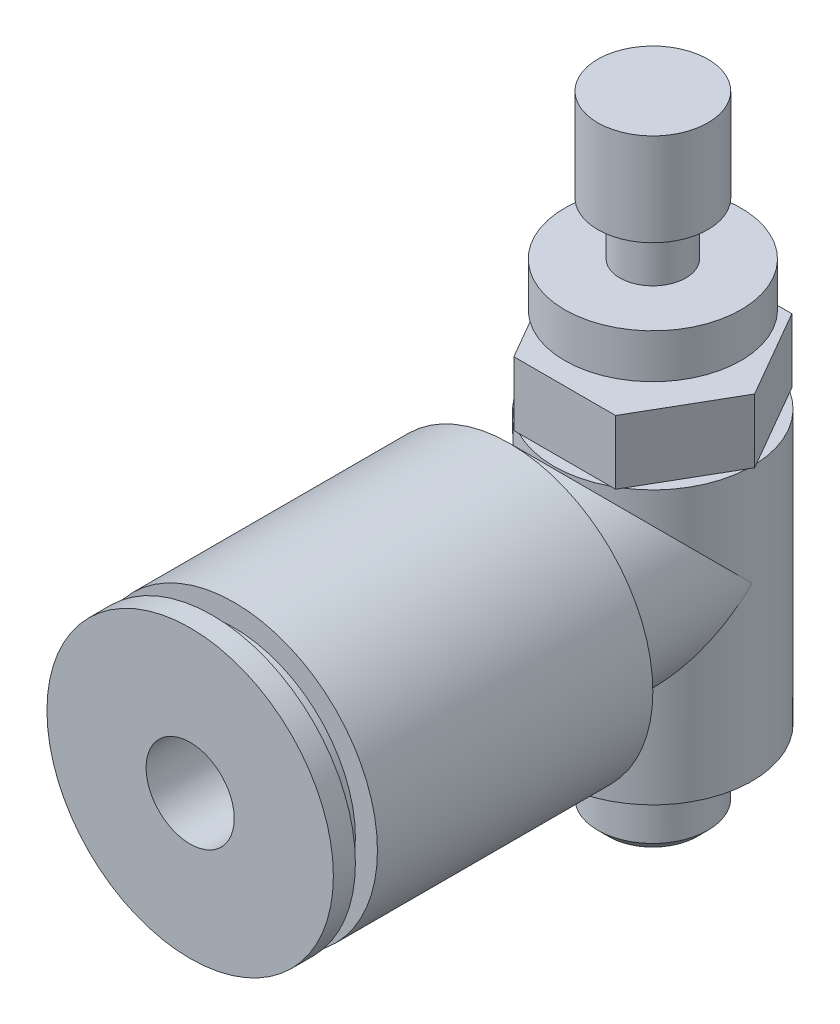
ISO-10303-21;
HEADER;
FILE_DESCRIPTION(('STEP AP214'),'2;1');
FILE_NAME('part.step','',(''),(''),'','','');
FILE_SCHEMA(('AUTOMOTIVE_DESIGN { 1 0 10303 214 1 1 1 1 }'));
ENDSEC;
DATA;
#1=APPLICATION_CONTEXT('core data for automotive mechanical design processes');
#2=APPLICATION_PROTOCOL_DEFINITION('international standard','automotive_design',2000,#1);
#3=PRODUCT_CONTEXT('',#1,'mechanical');
#4=PRODUCT('Part','Part','',(#3));
#5=PRODUCT_RELATED_PRODUCT_CATEGORY('part','',(#4));
#6=PRODUCT_DEFINITION_FORMATION('','',#4);
#7=PRODUCT_DEFINITION_CONTEXT('part definition',#1,'design');
#8=PRODUCT_DEFINITION('design','',#6,#7);
#9=PRODUCT_DEFINITION_SHAPE('','',#8);
#10=(LENGTH_UNIT() NAMED_UNIT(*) SI_UNIT(.MILLI.,.METRE.));
#11=(NAMED_UNIT(*) PLANE_ANGLE_UNIT() SI_UNIT($,.RADIAN.));
#12=(NAMED_UNIT(*) SI_UNIT($,.STERADIAN.) SOLID_ANGLE_UNIT());
#13=UNCERTAINTY_MEASURE_WITH_UNIT(LENGTH_MEASURE(1.E-05),#10,'distance_accuracy_value','');
#14=(GEOMETRIC_REPRESENTATION_CONTEXT(3) GLOBAL_UNCERTAINTY_ASSIGNED_CONTEXT((#13)) GLOBAL_UNIT_ASSIGNED_CONTEXT((#10,
#11,#12)) REPRESENTATION_CONTEXT('',''));
#15=CARTESIAN_POINT('',(0.,0.,0.));
#16=DIRECTION('',(0.,0.,1.));
#17=DIRECTION('',(1.,0.,0.));
#18=AXIS2_PLACEMENT_3D('',#15,#16,#17);
#19=CARTESIAN_POINT('',(-2.3094010767585,4.6,4.));
#20=DIRECTION('',(0.,1.,0.));
#21=DIRECTION('',(0.,0.,1.));
#22=AXIS2_PLACEMENT_3D('',#19,#20,#21);
#23=PLANE('',#22);
#24=DIRECTION('',(1.,0.,0.));
#25=VECTOR('',#24,1.);
#26=CARTESIAN_POINT('',(-2.3094010767585,4.6,4.));
#27=LINE('',#26,#25);
#28=CARTESIAN_POINT('',(2.06155281280883,4.6,4.));
#29=VERTEX_POINT('',#28);
#30=CARTESIAN_POINT('',(2.3094010767585,4.6,4.));
#31=VERTEX_POINT('',#30);
#32=EDGE_CURVE('E262',#29,#31,#27,.T.);
#33=ORIENTED_EDGE('',*,*,#32,.F.);
#34=CARTESIAN_POINT('',(0.,4.6,0.));
#35=DIRECTION('',(0.,1.,0.));
#36=DIRECTION('',(0.,0.,1.));
#37=AXIS2_PLACEMENT_3D('',#34,#35,#36);
#38=CIRCLE('',#37,4.5);
#39=CARTESIAN_POINT('',(2.43332520873333,4.6,3.78535710713572));
#40=VERTEX_POINT('',#39);
#41=EDGE_CURVE('E226',#29,#40,#38,.T.);
#42=ORIENTED_EDGE('',*,*,#41,.T.);
#43=DIRECTION('',(0.500000000000001,0.,-0.866025403784438));
#44=VECTOR('',#43,1.);
#45=CARTESIAN_POINT('',(2.3094010767585,4.6,4.));
#46=LINE('',#45,#44);
#47=EDGE_CURVE('E270',#31,#40,#46,.T.);
#48=ORIENTED_EDGE('',*,*,#47,.F.);
#49=EDGE_LOOP('',(#33,#42,#48));
#50=FACE_BOUND('',#49,.T.);
#51=ADVANCED_FACE('F32',(#50),#23,.F.);
#52=CARTESIAN_POINT('',(4.49487802154217,4.6,0.214642892864293));
#53=VERTEX_POINT('',#52);
#54=CARTESIAN_POINT('',(4.61880215351701,4.6,0.));
#55=VERTEX_POINT('',#54);
#56=EDGE_CURVE('E269',#53,#55,#46,.T.);
#57=ORIENTED_EDGE('',*,*,#56,.F.);
#58=CARTESIAN_POINT('',(4.49487802154217,4.6,-0.214642892864295));
#59=VERTEX_POINT('',#58);
#60=EDGE_CURVE('E132',#53,#59,#38,.T.);
#61=ORIENTED_EDGE('',*,*,#60,.T.);
#62=DIRECTION('',(-0.500000000000001,0.,-0.866025403784438));
#63=VECTOR('',#62,1.);
#64=CARTESIAN_POINT('',(4.61880215351701,4.6,0.));
#65=LINE('',#64,#63);
#66=EDGE_CURVE('E274',#55,#59,#65,.T.);
#67=ORIENTED_EDGE('',*,*,#66,.F.);
#68=EDGE_LOOP('',(#57,#61,#67));
#69=FACE_BOUND('',#68,.T.);
#70=ADVANCED_FACE('F160',(#69),#23,.F.);
#71=CARTESIAN_POINT('',(2.43332520873334,4.6,-3.78535710713572));
#72=VERTEX_POINT('',#71);
#73=CARTESIAN_POINT('',(2.3094010767585,4.6,-4.));
#74=VERTEX_POINT('',#73);
#75=EDGE_CURVE('E272',#72,#74,#65,.T.);
#76=ORIENTED_EDGE('',*,*,#75,.F.);
#77=CARTESIAN_POINT('',(2.06155281280883,4.6,-4.));
#78=VERTEX_POINT('',#77);
#79=EDGE_CURVE('E135',#72,#78,#38,.T.);
#80=ORIENTED_EDGE('',*,*,#79,.T.);
#81=DIRECTION('',(-1.,0.,0.));
#82=VECTOR('',#81,1.);
#83=CARTESIAN_POINT('',(2.3094010767585,4.6,-4.));
#84=LINE('',#83,#82);
#85=EDGE_CURVE('E209',#74,#78,#84,.T.);
#86=ORIENTED_EDGE('',*,*,#85,.F.);
#87=EDGE_LOOP('',(#76,#80,#86));
#88=FACE_BOUND('',#87,.T.);
#89=ADVANCED_FACE('F167',(#88),#23,.F.);
#90=CARTESIAN_POINT('',(-2.06155281280883,4.6,-4.));
#91=VERTEX_POINT('',#90);
#92=CARTESIAN_POINT('',(-2.3094010767585,4.6,-4.));
#93=VERTEX_POINT('',#92);
#94=EDGE_CURVE('E276',#91,#93,#84,.T.);
#95=ORIENTED_EDGE('',*,*,#94,.F.);
#96=CARTESIAN_POINT('',(-2.43332520873333,4.6,-3.78535710713572));
#97=VERTEX_POINT('',#96);
#98=EDGE_CURVE('E303',#91,#97,#38,.T.);
#99=ORIENTED_EDGE('',*,*,#98,.T.);
#100=DIRECTION('',(-0.500000000000001,0.,0.866025403784438));
#101=VECTOR('',#100,1.);
#102=CARTESIAN_POINT('',(-2.3094010767585,4.6,-4.));
#103=LINE('',#102,#101);
#104=EDGE_CURVE('E211',#93,#97,#103,.T.);
#105=ORIENTED_EDGE('',*,*,#104,.F.);
#106=EDGE_LOOP('',(#95,#99,#105));
#107=FACE_BOUND('',#106,.T.);
#108=ADVANCED_FACE('F189',(#107),#23,.F.);
#109=CARTESIAN_POINT('',(-4.49487802154217,4.6,-0.214642892864293));
#110=VERTEX_POINT('',#109);
#111=CARTESIAN_POINT('',(-4.61880215351701,4.6,0.));
#112=VERTEX_POINT('',#111);
#113=EDGE_CURVE('E201',#110,#112,#103,.T.);
#114=ORIENTED_EDGE('',*,*,#113,.F.);
#115=CARTESIAN_POINT('',(-4.49487802154217,4.6,0.214642892864295));
#116=VERTEX_POINT('',#115);
#117=EDGE_CURVE('E203',#110,#116,#38,.T.);
#118=ORIENTED_EDGE('',*,*,#117,.T.);
#119=DIRECTION('',(0.500000000000001,0.,0.866025403784438));
#120=VECTOR('',#119,1.);
#121=CARTESIAN_POINT('',(-4.61880215351701,4.6,0.));
#122=LINE('',#121,#120);
#123=EDGE_CURVE('E205',#112,#116,#122,.T.);
#124=ORIENTED_EDGE('',*,*,#123,.F.);
#125=EDGE_LOOP('',(#114,#118,#124));
#126=FACE_BOUND('',#125,.T.);
#127=ADVANCED_FACE('F176',(#126),#23,.F.);
#128=CARTESIAN_POINT('',(-4.61880215351701,4.6,0.));
#129=DIRECTION('',(-0.866025403784438,0.,0.500000000000001));
#130=DIRECTION('',(0.500000000000001,0.,0.866025403784438));
#131=AXIS2_PLACEMENT_3D('',#128,#129,#130);
#132=PLANE('',#131);
#133=DIRECTION('',(0.500000000000001,0.,0.866025403784438));
#134=VECTOR('',#133,1.);
#135=CARTESIAN_POINT('',(-4.61880215351701,7.5,0.));
#136=LINE('',#135,#134);
#137=CARTESIAN_POINT('',(-4.61880215351701,7.5,0.));
#138=VERTEX_POINT('',#137);
#139=CARTESIAN_POINT('',(-2.3094010767585,7.5,4.));
#140=VERTEX_POINT('',#139);
#141=EDGE_CURVE('E222',#138,#140,#136,.T.);
#142=ORIENTED_EDGE('',*,*,#141,.F.);
#143=DIRECTION('',(0.,1.,0.));
#144=VECTOR('',#143,1.);
#145=CARTESIAN_POINT('',(-4.61880215351701,4.6,0.));
#146=LINE('',#145,#144);
#147=EDGE_CURVE('E242',#112,#138,#146,.T.);
#148=ORIENTED_EDGE('',*,*,#147,.F.);
#149=ORIENTED_EDGE('',*,*,#123,.T.);
#150=CARTESIAN_POINT('',(-2.43332520873334,4.6,3.78535710713572));
#151=VERTEX_POINT('',#150);
#152=EDGE_CURVE('E261',#116,#151,#122,.T.);
#153=ORIENTED_EDGE('',*,*,#152,.T.);
#154=CARTESIAN_POINT('',(-2.3094010767585,4.6,4.));
#155=VERTEX_POINT('',#154);
#156=EDGE_CURVE('E241',#151,#155,#122,.T.);
#157=ORIENTED_EDGE('',*,*,#156,.T.);
#158=DIRECTION('',(0.,1.,0.));
#159=VECTOR('',#158,1.);
#160=CARTESIAN_POINT('',(-2.3094010767585,4.6,4.));
#161=LINE('',#160,#159);
#162=EDGE_CURVE('E139',#155,#140,#161,.T.);
#163=ORIENTED_EDGE('',*,*,#162,.T.);
#164=EDGE_LOOP('',(#142,#148,#149,#153,#157,#163));
#165=FACE_BOUND('',#164,.T.);
#166=ADVANCED_FACE('F188',(#165),#132,.T.);
#167=CARTESIAN_POINT('',(-2.3094010767585,4.6,-4.));
#168=DIRECTION('',(-0.866025403784438,0.,-0.500000000000001));
#169=DIRECTION('',(-0.500000000000001,0.,0.866025403784438));
#170=AXIS2_PLACEMENT_3D('',#167,#168,#169);
#171=PLANE('',#170);
#172=DIRECTION('',(-0.500000000000001,0.,0.866025403784438));
#173=VECTOR('',#172,1.);
#174=CARTESIAN_POINT('',(-2.3094010767585,7.5,-4.));
#175=LINE('',#174,#173);
#176=CARTESIAN_POINT('',(-2.3094010767585,7.5,-4.));
#177=VERTEX_POINT('',#176);
#178=EDGE_CURVE('E238',#177,#138,#175,.T.);
#179=ORIENTED_EDGE('',*,*,#178,.F.);
#180=DIRECTION('',(0.,1.,0.));
#181=VECTOR('',#180,1.);
#182=CARTESIAN_POINT('',(-2.3094010767585,4.6,-4.));
#183=LINE('',#182,#181);
#184=EDGE_CURVE('E245',#93,#177,#183,.T.);
#185=ORIENTED_EDGE('',*,*,#184,.F.);
#186=ORIENTED_EDGE('',*,*,#104,.T.);
#187=EDGE_CURVE('E208',#97,#110,#103,.T.);
#188=ORIENTED_EDGE('',*,*,#187,.T.);
#189=ORIENTED_EDGE('',*,*,#113,.T.);
#190=ORIENTED_EDGE('',*,*,#147,.T.);
#191=EDGE_LOOP('',(#179,#185,#186,#188,#189,#190));
#192=FACE_BOUND('',#191,.T.);
#193=ADVANCED_FACE('F195',(#192),#171,.T.);
#194=CARTESIAN_POINT('',(2.3094010767585,4.6,-4.));
#195=DIRECTION('',(0.,0.,-1.));
#196=DIRECTION('',(-1.,0.,0.));
#197=AXIS2_PLACEMENT_3D('',#194,#195,#196);
#198=PLANE('',#197);
#199=DIRECTION('',(-1.,0.,0.));
#200=VECTOR('',#199,1.);
#201=CARTESIAN_POINT('',(2.3094010767585,7.5,-4.));
#202=LINE('',#201,#200);
#203=CARTESIAN_POINT('',(2.3094010767585,7.5,-4.));
#204=VERTEX_POINT('',#203);
#205=EDGE_CURVE('E235',#204,#177,#202,.T.);
#206=ORIENTED_EDGE('',*,*,#205,.F.);
#207=DIRECTION('',(0.,1.,0.));
#208=VECTOR('',#207,1.);
#209=CARTESIAN_POINT('',(2.3094010767585,4.6,-4.));
#210=LINE('',#209,#208);
#211=EDGE_CURVE('E247',#74,#204,#210,.T.);
#212=ORIENTED_EDGE('',*,*,#211,.F.);
#213=ORIENTED_EDGE('',*,*,#85,.T.);
#214=EDGE_CURVE('E282',#78,#91,#84,.T.);
#215=ORIENTED_EDGE('',*,*,#214,.T.);
#216=ORIENTED_EDGE('',*,*,#94,.T.);
#217=ORIENTED_EDGE('',*,*,#184,.T.);
#218=EDGE_LOOP('',(#206,#212,#213,#215,#216,#217));
#219=FACE_BOUND('',#218,.T.);
#220=ADVANCED_FACE('F292',(#219),#198,.T.);
#221=CARTESIAN_POINT('',(4.61880215351701,4.6,0.));
#222=DIRECTION('',(0.866025403784438,0.,-0.500000000000001));
#223=DIRECTION('',(-0.500000000000001,0.,-0.866025403784438));
#224=AXIS2_PLACEMENT_3D('',#221,#222,#223);
#225=PLANE('',#224);
#226=DIRECTION('',(-0.500000000000001,0.,-0.866025403784438));
#227=VECTOR('',#226,1.);
#228=CARTESIAN_POINT('',(4.61880215351701,7.5,0.));
#229=LINE('',#228,#227);
#230=CARTESIAN_POINT('',(4.61880215351701,7.5,0.));
#231=VERTEX_POINT('',#230);
#232=EDGE_CURVE('E232',#231,#204,#229,.T.);
#233=ORIENTED_EDGE('',*,*,#232,.F.);
#234=DIRECTION('',(0.,1.,0.));
#235=VECTOR('',#234,1.);
#236=CARTESIAN_POINT('',(4.61880215351701,4.6,0.));
#237=LINE('',#236,#235);
#238=EDGE_CURVE('E249',#55,#231,#237,.T.);
#239=ORIENTED_EDGE('',*,*,#238,.F.);
#240=ORIENTED_EDGE('',*,*,#66,.T.);
#241=EDGE_CURVE('E277',#59,#72,#65,.T.);
#242=ORIENTED_EDGE('',*,*,#241,.T.);
#243=ORIENTED_EDGE('',*,*,#75,.T.);
#244=ORIENTED_EDGE('',*,*,#211,.T.);
#245=EDGE_LOOP('',(#233,#239,#240,#242,#243,#244));
#246=FACE_BOUND('',#245,.T.);
#247=ADVANCED_FACE('F286',(#246),#225,.T.);
#248=CARTESIAN_POINT('',(2.3094010767585,4.6,4.));
#249=DIRECTION('',(0.866025403784438,0.,0.500000000000001));
#250=DIRECTION('',(0.500000000000001,0.,-0.866025403784438));
#251=AXIS2_PLACEMENT_3D('',#248,#249,#250);
#252=PLANE('',#251);
#253=DIRECTION('',(0.500000000000001,0.,-0.866025403784438));
#254=VECTOR('',#253,1.);
#255=CARTESIAN_POINT('',(2.3094010767585,7.5,4.));
#256=LINE('',#255,#254);
#257=CARTESIAN_POINT('',(2.3094010767585,7.5,4.));
#258=VERTEX_POINT('',#257);
#259=EDGE_CURVE('E229',#258,#231,#256,.T.);
#260=ORIENTED_EDGE('',*,*,#259,.F.);
#261=DIRECTION('',(0.,1.,0.));
#262=VECTOR('',#261,1.);
#263=CARTESIAN_POINT('',(2.3094010767585,4.6,4.));
#264=LINE('',#263,#262);
#265=EDGE_CURVE('E250',#31,#258,#264,.T.);
#266=ORIENTED_EDGE('',*,*,#265,.F.);
#267=ORIENTED_EDGE('',*,*,#47,.T.);
#268=EDGE_CURVE('E273',#40,#53,#46,.T.);
#269=ORIENTED_EDGE('',*,*,#268,.T.);
#270=ORIENTED_EDGE('',*,*,#56,.T.);
#271=ORIENTED_EDGE('',*,*,#238,.T.);
#272=EDGE_LOOP('',(#260,#266,#267,#269,#270,#271));
#273=FACE_BOUND('',#272,.T.);
#274=ADVANCED_FACE('F183',(#273),#252,.T.);
#275=CARTESIAN_POINT('',(-2.3094010767585,4.6,4.));
#276=DIRECTION('',(0.,0.,1.));
#277=DIRECTION('',(1.,0.,0.));
#278=AXIS2_PLACEMENT_3D('',#275,#276,#277);
#279=PLANE('',#278);
#280=DIRECTION('',(1.,0.,0.));
#281=VECTOR('',#280,1.);
#282=CARTESIAN_POINT('',(-2.3094010767585,7.5,4.));
#283=LINE('',#282,#281);
#284=EDGE_CURVE('E225',#140,#258,#283,.T.);
#285=ORIENTED_EDGE('',*,*,#284,.F.);
#286=ORIENTED_EDGE('',*,*,#162,.F.);
#287=CARTESIAN_POINT('',(-2.06155281280883,4.6,4.));
#288=VERTEX_POINT('',#287);
#289=EDGE_CURVE('E266',#155,#288,#27,.T.);
#290=ORIENTED_EDGE('',*,*,#289,.T.);
#291=EDGE_CURVE('E264',#288,#29,#27,.T.);
#292=ORIENTED_EDGE('',*,*,#291,.T.);
#293=ORIENTED_EDGE('',*,*,#32,.T.);
#294=ORIENTED_EDGE('',*,*,#265,.T.);
#295=EDGE_LOOP('',(#285,#286,#290,#292,#293,#294));
#296=FACE_BOUND('',#295,.T.);
#297=ADVANCED_FACE('F174',(#296),#279,.T.);
#298=ORIENTED_EDGE('',*,*,#156,.F.);
#299=EDGE_CURVE('E244',#151,#288,#38,.T.);
#300=ORIENTED_EDGE('',*,*,#299,.T.);
#301=ORIENTED_EDGE('',*,*,#289,.F.);
#302=EDGE_LOOP('',(#298,#300,#301));
#303=FACE_BOUND('',#302,.T.);
#304=ADVANCED_FACE('F163',(#303),#23,.F.);
#305=CARTESIAN_POINT('',(-2.3094010767585,7.5,4.));
#306=DIRECTION('',(0.,1.,0.));
#307=DIRECTION('',(0.,0.,1.));
#308=AXIS2_PLACEMENT_3D('',#305,#306,#307);
#309=PLANE('',#308);
#310=CARTESIAN_POINT('',(0.,7.5,0.));
#311=DIRECTION('',(0.,1.,0.));
#312=DIRECTION('',(0.,0.,1.));
#313=AXIS2_PLACEMENT_3D('',#310,#311,#312);
#314=CIRCLE('',#313,2.5);
#315=CARTESIAN_POINT('',(0.,7.5,2.5));
#316=VERTEX_POINT('',#315);
#317=EDGE_CURVE('E128',#316,#316,#314,.T.);
#318=ORIENTED_EDGE('',*,*,#317,.F.);
#319=EDGE_LOOP('',(#318));
#320=FACE_BOUND('',#319,.T.);
#321=ORIENTED_EDGE('',*,*,#141,.T.);
#322=ORIENTED_EDGE('',*,*,#284,.T.);
#323=ORIENTED_EDGE('',*,*,#259,.T.);
#324=ORIENTED_EDGE('',*,*,#232,.T.);
#325=ORIENTED_EDGE('',*,*,#205,.T.);
#326=ORIENTED_EDGE('',*,*,#178,.T.);
#327=EDGE_LOOP('',(#321,#322,#323,#324,#325,#326));
#328=FACE_BOUND('',#327,.T.);
#329=ADVANCED_FACE('F173',(#320,#328),#309,.T.);
#330=CARTESIAN_POINT('',(0.,4.6,0.));
#331=DIRECTION('',(0.,1.,0.));
#332=DIRECTION('',(0.,0.,1.));
#333=AXIS2_PLACEMENT_3D('',#330,#331,#332);
#334=PLANE('',#333);
#335=ORIENTED_EDGE('',*,*,#152,.F.);
#336=EDGE_CURVE('E306',#116,#151,#38,.T.);
#337=ORIENTED_EDGE('',*,*,#336,.T.);
#338=EDGE_LOOP('',(#335,#337));
#339=FACE_BOUND('',#338,.T.);
#340=ADVANCED_FACE('F181',(#339),#334,.T.);
#341=ORIENTED_EDGE('',*,*,#187,.F.);
#342=EDGE_CURVE('E305',#97,#110,#38,.T.);
#343=ORIENTED_EDGE('',*,*,#342,.T.);
#344=EDGE_LOOP('',(#341,#343));
#345=FACE_BOUND('',#344,.T.);
#346=ADVANCED_FACE('F333',(#345),#334,.T.);
#347=ORIENTED_EDGE('',*,*,#214,.F.);
#348=EDGE_CURVE('E299',#78,#91,#38,.T.);
#349=ORIENTED_EDGE('',*,*,#348,.T.);
#350=EDGE_LOOP('',(#347,#349));
#351=FACE_BOUND('',#350,.T.);
#352=ADVANCED_FACE('F298',(#351),#334,.T.);
#353=ORIENTED_EDGE('',*,*,#241,.F.);
#354=EDGE_CURVE('E304',#59,#72,#38,.T.);
#355=ORIENTED_EDGE('',*,*,#354,.T.);
#356=EDGE_LOOP('',(#353,#355));
#357=FACE_BOUND('',#356,.T.);
#358=ADVANCED_FACE('F328',(#357),#334,.T.);
#359=ORIENTED_EDGE('',*,*,#268,.F.);
#360=EDGE_CURVE('E137',#40,#53,#38,.T.);
#361=ORIENTED_EDGE('',*,*,#360,.T.);
#362=EDGE_LOOP('',(#359,#361));
#363=FACE_BOUND('',#362,.T.);
#364=ADVANCED_FACE('F321',(#363),#334,.T.);
#365=ORIENTED_EDGE('',*,*,#291,.F.);
#366=EDGE_CURVE('E54',#288,#29,#38,.T.);
#367=ORIENTED_EDGE('',*,*,#366,.T.);
#368=EDGE_LOOP('',(#365,#367));
#369=FACE_BOUND('',#368,.T.);
#370=ADVANCED_FACE('F319',(#369),#334,.T.);
#371=CARTESIAN_POINT('',(0.,-11.2,0.));
#372=DIRECTION('',(0.,1.,0.));
#373=DIRECTION('',(0.,0.,1.));
#374=AXIS2_PLACEMENT_3D('',#371,#372,#373);
#375=CYLINDRICAL_SURFACE('',#374,2.5);
#376=CARTESIAN_POINT('',(0.,-10.7099999999768,0.));
#377=DIRECTION('',(0.,-1.,0.));
#378=DIRECTION('',(0.,0.,-1.));
#379=AXIS2_PLACEMENT_3D('',#376,#377,#378);
#380=CIRCLE('',#379,2.5);
#381=CARTESIAN_POINT('',(0.,-10.7099999999768,-2.5));
#382=VERTEX_POINT('',#381);
#383=EDGE_CURVE('E40',#382,#382,#380,.F.);
#384=ORIENTED_EDGE('',*,*,#383,.T.);
#385=EDGE_LOOP('',(#384));
#386=FACE_BOUND('',#385,.T.);
#387=CARTESIAN_POINT('',(0.,-7.78,0.));
#388=DIRECTION('',(0.,1.,0.));
#389=DIRECTION('',(0.,0.,1.));
#390=AXIS2_PLACEMENT_3D('',#387,#388,#389);
#391=CIRCLE('',#390,2.5);
#392=CARTESIAN_POINT('',(0.,-7.78,2.5));
#393=VERTEX_POINT('',#392);
#394=EDGE_CURVE('E313',#393,#393,#391,.T.);
#395=ORIENTED_EDGE('',*,*,#394,.F.);
#396=EDGE_LOOP('',(#395));
#397=FACE_BOUND('',#396,.T.);
#398=ADVANCED_FACE('F146',(#386,#397),#375,.T.);
#399=CARTESIAN_POINT('',(2.5,-11.2,0.));
#400=DIRECTION('',(0.,-1.,0.));
#401=DIRECTION('',(0.,0.,-1.));
#402=AXIS2_PLACEMENT_3D('',#399,#400,#401);
#403=PLANE('',#402);
#404=CARTESIAN_POINT('',(0.,-11.2,0.));
#405=DIRECTION('',(0.,-1.,0.));
#406=DIRECTION('',(0.,0.,-1.));
#407=AXIS2_PLACEMENT_3D('',#404,#405,#406);
#408=CIRCLE('',#407,2.00999999997678);
#409=CARTESIAN_POINT('',(0.,-11.2,-2.00999999997678));
#410=VERTEX_POINT('',#409);
#411=EDGE_CURVE('E11',#410,#410,#408,.T.);
#412=ORIENTED_EDGE('',*,*,#411,.T.);
#413=EDGE_LOOP('',(#412));
#414=FACE_BOUND('',#413,.T.);
#415=ADVANCED_FACE('F327',(#414),#403,.T.);
#416=CARTESIAN_POINT('',(0.,-11.2,0.));
#417=DIRECTION('',(0.,1.,0.));
#418=DIRECTION('',(0.,0.,1.));
#419=AXIS2_PLACEMENT_3D('',#416,#417,#418);
#420=CYLINDRICAL_SURFACE('',#419,4.5);
#421=CARTESIAN_POINT('',(0.,0.,0.));
#422=DIRECTION('',(0.,0.707106781186547,0.707106781186547));
#423=DIRECTION('',(0.,0.707106781186547,-0.707106781186547));
#424=AXIS2_PLACEMENT_3D('',#421,#422,#423);
#425=ELLIPSE('',#424,6.36396103067893,4.5);
#426=CARTESIAN_POINT('',(-4.5,0.,0.));
#427=VERTEX_POINT('',#426);
#428=CARTESIAN_POINT('',(4.5,0.,0.));
#429=VERTEX_POINT('',#428);
#430=EDGE_CURVE('E124',#427,#429,#425,.T.);
#431=ORIENTED_EDGE('',*,*,#430,.F.);
#432=CARTESIAN_POINT('',(0.,0.,0.));
#433=DIRECTION('',(0.,0.707106781186547,-0.707106781186547));
#434=DIRECTION('',(0.,0.707106781186547,0.707106781186547));
#435=AXIS2_PLACEMENT_3D('',#432,#433,#434);
#436=ELLIPSE('',#435,6.36396103067893,4.5);
#437=EDGE_CURVE('E46',#429,#427,#436,.F.);
#438=ORIENTED_EDGE('',*,*,#437,.F.);
#439=EDGE_LOOP('',(#431,#438));
#440=FACE_BOUND('',#439,.T.);
#441=CARTESIAN_POINT('',(0.,-7.78,0.));
#442=DIRECTION('',(0.,1.,0.));
#443=DIRECTION('',(0.,0.,1.));
#444=AXIS2_PLACEMENT_3D('',#441,#442,#443);
#445=CIRCLE('',#444,4.5);
#446=CARTESIAN_POINT('',(0.,-7.78,4.5));
#447=VERTEX_POINT('',#446);
#448=EDGE_CURVE('E310',#447,#447,#445,.T.);
#449=ORIENTED_EDGE('',*,*,#448,.T.);
#450=EDGE_LOOP('',(#449));
#451=FACE_BOUND('',#450,.T.);
#452=ORIENTED_EDGE('',*,*,#41,.F.);
#453=ORIENTED_EDGE('',*,*,#366,.F.);
#454=ORIENTED_EDGE('',*,*,#299,.F.);
#455=ORIENTED_EDGE('',*,*,#336,.F.);
#456=ORIENTED_EDGE('',*,*,#117,.F.);
#457=ORIENTED_EDGE('',*,*,#342,.F.);
#458=ORIENTED_EDGE('',*,*,#98,.F.);
#459=ORIENTED_EDGE('',*,*,#348,.F.);
#460=ORIENTED_EDGE('',*,*,#79,.F.);
#461=ORIENTED_EDGE('',*,*,#354,.F.);
#462=ORIENTED_EDGE('',*,*,#60,.F.);
#463=ORIENTED_EDGE('',*,*,#360,.F.);
#464=EDGE_LOOP('',(#452,#453,#454,#455,#456,#457,#458,#459,#460,#461,#462,#463));
#465=FACE_BOUND('',#464,.T.);
#466=ADVANCED_FACE('F125',(#440,#451,#465),#420,.T.);
#467=CARTESIAN_POINT('',(4.5,-7.78,0.));
#468=DIRECTION('',(0.,-1.,0.));
#469=DIRECTION('',(0.,0.,-1.));
#470=AXIS2_PLACEMENT_3D('',#467,#468,#469);
#471=PLANE('',#470);
#472=ORIENTED_EDGE('',*,*,#394,.T.);
#473=EDGE_LOOP('',(#472));
#474=FACE_BOUND('',#473,.T.);
#475=ORIENTED_EDGE('',*,*,#448,.F.);
#476=EDGE_LOOP('',(#475));
#477=FACE_BOUND('',#476,.T.);
#478=ADVANCED_FACE('F420',(#474,#477),#471,.T.);
#479=CARTESIAN_POINT('',(0.,0.,21.));
#480=DIRECTION('',(0.,0.,1.));
#481=DIRECTION('',(1.,0.,0.));
#482=AXIS2_PLACEMENT_3D('',#479,#480,#481);
#483=PLANE('',#482);
#484=CARTESIAN_POINT('',(0.,0.,21.));
#485=DIRECTION('',(0.,0.,1.));
#486=DIRECTION('',(1.,0.,0.));
#487=AXIS2_PLACEMENT_3D('',#484,#485,#486);
#488=CIRCLE('',#487,2.00000000000001);
#489=CARTESIAN_POINT('',(2.00000000000001,0.,21.));
#490=VERTEX_POINT('',#489);
#491=EDGE_CURVE('E636',#490,#490,#488,.T.);
#492=ORIENTED_EDGE('',*,*,#491,.F.);
#493=EDGE_LOOP('',(#492));
#494=FACE_BOUND('',#493,.T.);
#495=CARTESIAN_POINT('',(0.,0.,21.));
#496=DIRECTION('',(0.,0.,1.));
#497=DIRECTION('',(1.,0.,0.));
#498=AXIS2_PLACEMENT_3D('',#495,#496,#497);
#499=CIRCLE('',#498,6.49999999999999);
#500=CARTESIAN_POINT('',(6.49999999999999,0.,21.));
#501=VERTEX_POINT('',#500);
#502=EDGE_CURVE('E679',#501,#501,#499,.T.);
#503=ORIENTED_EDGE('',*,*,#502,.T.);
#504=EDGE_LOOP('',(#503));
#505=FACE_BOUND('',#504,.T.);
#506=ADVANCED_FACE('F425',(#494,#505),#483,.T.);
#507=CARTESIAN_POINT('',(0.,0.,0.));
#508=DIRECTION('',(0.,0.,1.));
#509=DIRECTION('',(1.,0.,0.));
#510=AXIS2_PLACEMENT_3D('',#507,#508,#509);
#511=CYLINDRICAL_SURFACE('',#510,6.49999999999999);
#512=CARTESIAN_POINT('',(0.,0.,20.));
#513=DIRECTION('',(0.,0.,1.));
#514=DIRECTION('',(1.,0.,0.));
#515=AXIS2_PLACEMENT_3D('',#512,#513,#514);
#516=CIRCLE('',#515,6.49999999999999);
#517=CARTESIAN_POINT('',(6.49999999999999,0.,20.));
#518=VERTEX_POINT('',#517);
#519=EDGE_CURVE('E676',#518,#518,#516,.T.);
#520=ORIENTED_EDGE('',*,*,#519,.T.);
#521=EDGE_LOOP('',(#520));
#522=FACE_BOUND('',#521,.T.);
#523=ORIENTED_EDGE('',*,*,#502,.F.);
#524=EDGE_LOOP('',(#523));
#525=FACE_BOUND('',#524,.T.);
#526=ADVANCED_FACE('F442',(#522,#525),#511,.T.);
#527=CARTESIAN_POINT('',(6.49999999999999,0.,20.));
#528=DIRECTION('',(0.,0.,-1.));
#529=DIRECTION('',(-1.,0.,0.));
#530=AXIS2_PLACEMENT_3D('',#527,#528,#529);
#531=PLANE('',#530);
#532=CARTESIAN_POINT('',(0.,0.,20.));
#533=DIRECTION('',(0.,0.,1.));
#534=DIRECTION('',(1.,0.,0.));
#535=AXIS2_PLACEMENT_3D('',#532,#533,#534);
#536=CIRCLE('',#535,5.50000000000001);
#537=CARTESIAN_POINT('',(5.50000000000001,0.,20.));
#538=VERTEX_POINT('',#537);
#539=EDGE_CURVE('E673',#538,#538,#536,.T.);
#540=ORIENTED_EDGE('',*,*,#539,.T.);
#541=EDGE_LOOP('',(#540));
#542=FACE_BOUND('',#541,.T.);
#543=ORIENTED_EDGE('',*,*,#519,.F.);
#544=EDGE_LOOP('',(#543));
#545=FACE_BOUND('',#544,.T.);
#546=ADVANCED_FACE('F447',(#542,#545),#531,.T.);
#547=CARTESIAN_POINT('',(0.,0.,0.));
#548=DIRECTION('',(0.,0.,1.));
#549=DIRECTION('',(1.,0.,0.));
#550=AXIS2_PLACEMENT_3D('',#547,#548,#549);
#551=CYLINDRICAL_SURFACE('',#550,5.50000000000001);
#552=CARTESIAN_POINT('',(0.,0.,19.));
#553=DIRECTION('',(0.,0.,1.));
#554=DIRECTION('',(1.,0.,0.));
#555=AXIS2_PLACEMENT_3D('',#552,#553,#554);
#556=CIRCLE('',#555,5.50000000000001);
#557=CARTESIAN_POINT('',(5.50000000000001,0.,19.));
#558=VERTEX_POINT('',#557);
#559=EDGE_CURVE('E670',#558,#558,#556,.T.);
#560=ORIENTED_EDGE('',*,*,#559,.T.);
#561=EDGE_LOOP('',(#560));
#562=FACE_BOUND('',#561,.T.);
#563=ORIENTED_EDGE('',*,*,#539,.F.);
#564=EDGE_LOOP('',(#563));
#565=FACE_BOUND('',#564,.T.);
#566=ADVANCED_FACE('F457',(#562,#565),#551,.T.);
#567=CARTESIAN_POINT('',(5.50000000000001,0.,19.));
#568=DIRECTION('',(0.,0.,1.));
#569=DIRECTION('',(1.,0.,0.));
#570=AXIS2_PLACEMENT_3D('',#567,#568,#569);
#571=PLANE('',#570);
#572=CARTESIAN_POINT('',(0.,0.,19.));
#573=DIRECTION('',(0.,0.,1.));
#574=DIRECTION('',(1.,0.,0.));
#575=AXIS2_PLACEMENT_3D('',#572,#573,#574);
#576=CIRCLE('',#575,6.49999999999999);
#577=CARTESIAN_POINT('',(6.49999999999999,0.,19.));
#578=VERTEX_POINT('',#577);
#579=EDGE_CURVE('E667',#578,#578,#576,.T.);
#580=ORIENTED_EDGE('',*,*,#579,.T.);
#581=EDGE_LOOP('',(#580));
#582=FACE_BOUND('',#581,.T.);
#583=ORIENTED_EDGE('',*,*,#559,.F.);
#584=EDGE_LOOP('',(#583));
#585=FACE_BOUND('',#584,.T.);
#586=ADVANCED_FACE('F467',(#582,#585),#571,.T.);
#587=CARTESIAN_POINT('',(0.,0.,0.));
#588=DIRECTION('',(0.,0.,1.));
#589=DIRECTION('',(1.,0.,0.));
#590=AXIS2_PLACEMENT_3D('',#587,#588,#589);
#591=CYLINDRICAL_SURFACE('',#590,6.49999999999999);
#592=CARTESIAN_POINT('',(0.,0.,6.5));
#593=DIRECTION('',(0.,0.,1.));
#594=DIRECTION('',(1.,0.,0.));
#595=AXIS2_PLACEMENT_3D('',#592,#593,#594);
#596=CIRCLE('',#595,6.49999999999999);
#597=CARTESIAN_POINT('',(6.49999999999999,0.,6.5));
#598=VERTEX_POINT('',#597);
#599=EDGE_CURVE('E664',#598,#598,#596,.T.);
#600=ORIENTED_EDGE('',*,*,#599,.T.);
#601=EDGE_LOOP('',(#600));
#602=FACE_BOUND('',#601,.T.);
#603=ORIENTED_EDGE('',*,*,#579,.F.);
#604=EDGE_LOOP('',(#603));
#605=FACE_BOUND('',#604,.T.);
#606=ADVANCED_FACE('F477',(#602,#605),#591,.T.);
#607=CARTESIAN_POINT('',(6.49999999999999,0.,6.5));
#608=DIRECTION('',(0.,0.,-1.));
#609=DIRECTION('',(-1.,0.,0.));
#610=AXIS2_PLACEMENT_3D('',#607,#608,#609);
#611=PLANE('',#610);
#612=CARTESIAN_POINT('',(0.,0.,6.5));
#613=DIRECTION('',(0.,0.,1.));
#614=DIRECTION('',(1.,0.,0.));
#615=AXIS2_PLACEMENT_3D('',#612,#613,#614);
#616=CIRCLE('',#615,4.5);
#617=CARTESIAN_POINT('',(4.5,0.,6.5));
#618=VERTEX_POINT('',#617);
#619=EDGE_CURVE('E661',#618,#618,#616,.T.);
#620=ORIENTED_EDGE('',*,*,#619,.T.);
#621=EDGE_LOOP('',(#620));
#622=FACE_BOUND('',#621,.T.);
#623=ORIENTED_EDGE('',*,*,#599,.F.);
#624=EDGE_LOOP('',(#623));
#625=FACE_BOUND('',#624,.T.);
#626=ADVANCED_FACE('F487',(#622,#625),#611,.T.);
#627=CARTESIAN_POINT('',(0.,0.,0.));
#628=DIRECTION('',(0.,0.,1.));
#629=DIRECTION('',(1.,0.,0.));
#630=AXIS2_PLACEMENT_3D('',#627,#628,#629);
#631=CYLINDRICAL_SURFACE('',#630,4.5);
#632=ORIENTED_EDGE('',*,*,#437,.T.);
#633=ORIENTED_EDGE('',*,*,#430,.T.);
#634=EDGE_LOOP('',(#632,#633));
#635=FACE_BOUND('',#634,.T.);
#636=ORIENTED_EDGE('',*,*,#619,.F.);
#637=EDGE_LOOP('',(#636));
#638=FACE_BOUND('',#637,.T.);
#639=ADVANCED_FACE('F130',(#635,#638),#631,.T.);
#640=CARTESIAN_POINT('',(0.,7.5,0.));
#641=DIRECTION('',(0.,1.,0.));
#642=DIRECTION('',(0.,0.,1.));
#643=AXIS2_PLACEMENT_3D('',#640,#641,#642);
#644=CYLINDRICAL_SURFACE('',#643,2.5);
#645=ORIENTED_EDGE('',*,*,#317,.T.);
#646=EDGE_LOOP('',(#645));
#647=FACE_BOUND('',#646,.T.);
#648=CARTESIAN_POINT('',(0.,8.5,0.));
#649=DIRECTION('',(0.,1.,0.));
#650=DIRECTION('',(0.,0.,1.));
#651=AXIS2_PLACEMENT_3D('',#648,#649,#650);
#652=CIRCLE('',#651,2.5);
#653=CARTESIAN_POINT('',(0.,8.5,2.5));
#654=VERTEX_POINT('',#653);
#655=EDGE_CURVE('E635',#654,#654,#652,.T.);
#656=ORIENTED_EDGE('',*,*,#655,.F.);
#657=EDGE_LOOP('',(#656));
#658=FACE_BOUND('',#657,.T.);
#659=ADVANCED_FACE('F506',(#647,#658),#644,.T.);
#660=CARTESIAN_POINT('',(0.,17.1,0.));
#661=DIRECTION('',(0.,1.,0.));
#662=DIRECTION('',(0.,0.,1.));
#663=AXIS2_PLACEMENT_3D('',#660,#661,#662);
#664=PLANE('',#663);
#665=CARTESIAN_POINT('',(0.,17.1,0.));
#666=DIRECTION('',(0.,1.,0.));
#667=DIRECTION('',(0.,0.,1.));
#668=AXIS2_PLACEMENT_3D('',#665,#666,#667);
#669=CIRCLE('',#668,2.5);
#670=CARTESIAN_POINT('',(0.,17.1,2.5));
#671=VERTEX_POINT('',#670);
#672=EDGE_CURVE('E658',#671,#671,#669,.T.);
#673=ORIENTED_EDGE('',*,*,#672,.T.);
#674=EDGE_LOOP('',(#673));
#675=FACE_BOUND('',#674,.T.);
#676=ADVANCED_FACE('F521',(#675),#664,.T.);
#677=CARTESIAN_POINT('',(0.,7.5,0.));
#678=DIRECTION('',(0.,1.,0.));
#679=DIRECTION('',(0.,0.,1.));
#680=AXIS2_PLACEMENT_3D('',#677,#678,#679);
#681=CYLINDRICAL_SURFACE('',#680,2.5);
#682=CARTESIAN_POINT('',(0.,12.9,0.));
#683=DIRECTION('',(0.,1.,0.));
#684=DIRECTION('',(0.,0.,1.));
#685=AXIS2_PLACEMENT_3D('',#682,#683,#684);
#686=CIRCLE('',#685,2.5);
#687=CARTESIAN_POINT('',(0.,12.9,2.5));
#688=VERTEX_POINT('',#687);
#689=EDGE_CURVE('E655',#688,#688,#686,.T.);
#690=ORIENTED_EDGE('',*,*,#689,.T.);
#691=EDGE_LOOP('',(#690));
#692=FACE_BOUND('',#691,.T.);
#693=ORIENTED_EDGE('',*,*,#672,.F.);
#694=EDGE_LOOP('',(#693));
#695=FACE_BOUND('',#694,.T.);
#696=ADVANCED_FACE('F531',(#692,#695),#681,.T.);
#697=CARTESIAN_POINT('',(2.5,12.9,0.));
#698=DIRECTION('',(0.,-1.,0.));
#699=DIRECTION('',(0.,0.,-1.));
#700=AXIS2_PLACEMENT_3D('',#697,#698,#699);
#701=PLANE('',#700);
#702=CARTESIAN_POINT('',(0.,12.9,0.));
#703=DIRECTION('',(0.,1.,0.));
#704=DIRECTION('',(0.,0.,1.));
#705=AXIS2_PLACEMENT_3D('',#702,#703,#704);
#706=CIRCLE('',#705,1.5);
#707=CARTESIAN_POINT('',(0.,12.9,1.5));
#708=VERTEX_POINT('',#707);
#709=EDGE_CURVE('E652',#708,#708,#706,.T.);
#710=ORIENTED_EDGE('',*,*,#709,.T.);
#711=EDGE_LOOP('',(#710));
#712=FACE_BOUND('',#711,.T.);
#713=ORIENTED_EDGE('',*,*,#689,.F.);
#714=EDGE_LOOP('',(#713));
#715=FACE_BOUND('',#714,.T.);
#716=ADVANCED_FACE('F541',(#712,#715),#701,.T.);
#717=CARTESIAN_POINT('',(0.,7.5,0.));
#718=DIRECTION('',(0.,1.,0.));
#719=DIRECTION('',(0.,0.,1.));
#720=AXIS2_PLACEMENT_3D('',#717,#718,#719);
#721=CYLINDRICAL_SURFACE('',#720,1.5);
#722=CARTESIAN_POINT('',(0.,10.5,0.));
#723=DIRECTION('',(0.,1.,0.));
#724=DIRECTION('',(0.,0.,1.));
#725=AXIS2_PLACEMENT_3D('',#722,#723,#724);
#726=CIRCLE('',#725,1.5);
#727=CARTESIAN_POINT('',(0.,10.5,1.5));
#728=VERTEX_POINT('',#727);
#729=EDGE_CURVE('E649',#728,#728,#726,.T.);
#730=ORIENTED_EDGE('',*,*,#729,.T.);
#731=EDGE_LOOP('',(#730));
#732=FACE_BOUND('',#731,.T.);
#733=ORIENTED_EDGE('',*,*,#709,.F.);
#734=EDGE_LOOP('',(#733));
#735=FACE_BOUND('',#734,.T.);
#736=ADVANCED_FACE('F551',(#732,#735),#721,.T.);
#737=CARTESIAN_POINT('',(1.5,10.5,0.));
#738=DIRECTION('',(0.,1.,0.));
#739=DIRECTION('',(0.,0.,1.));
#740=AXIS2_PLACEMENT_3D('',#737,#738,#739);
#741=PLANE('',#740);
#742=CARTESIAN_POINT('',(0.,10.5,0.));
#743=DIRECTION('',(0.,1.,0.));
#744=DIRECTION('',(0.,0.,1.));
#745=AXIS2_PLACEMENT_3D('',#742,#743,#744);
#746=CIRCLE('',#745,4.);
#747=CARTESIAN_POINT('',(0.,10.5,4.));
#748=VERTEX_POINT('',#747);
#749=EDGE_CURVE('E646',#748,#748,#746,.T.);
#750=ORIENTED_EDGE('',*,*,#749,.T.);
#751=EDGE_LOOP('',(#750));
#752=FACE_BOUND('',#751,.T.);
#753=ORIENTED_EDGE('',*,*,#729,.F.);
#754=EDGE_LOOP('',(#753));
#755=FACE_BOUND('',#754,.T.);
#756=ADVANCED_FACE('F561',(#752,#755),#741,.T.);
#757=CARTESIAN_POINT('',(0.,7.5,0.));
#758=DIRECTION('',(0.,1.,0.));
#759=DIRECTION('',(0.,0.,1.));
#760=AXIS2_PLACEMENT_3D('',#757,#758,#759);
#761=CYLINDRICAL_SURFACE('',#760,4.);
#762=CARTESIAN_POINT('',(0.,8.5,0.));
#763=DIRECTION('',(0.,1.,0.));
#764=DIRECTION('',(0.,0.,1.));
#765=AXIS2_PLACEMENT_3D('',#762,#763,#764);
#766=CIRCLE('',#765,4.);
#767=CARTESIAN_POINT('',(0.,8.5,4.));
#768=VERTEX_POINT('',#767);
#769=EDGE_CURVE('E639',#768,#768,#766,.T.);
#770=ORIENTED_EDGE('',*,*,#769,.T.);
#771=EDGE_LOOP('',(#770));
#772=FACE_BOUND('',#771,.T.);
#773=ORIENTED_EDGE('',*,*,#749,.F.);
#774=EDGE_LOOP('',(#773));
#775=FACE_BOUND('',#774,.T.);
#776=ADVANCED_FACE('F571',(#772,#775),#761,.T.);
#777=CARTESIAN_POINT('',(4.,8.5,0.));
#778=DIRECTION('',(0.,-1.,0.));
#779=DIRECTION('',(0.,0.,-1.));
#780=AXIS2_PLACEMENT_3D('',#777,#778,#779);
#781=PLANE('',#780);
#782=ORIENTED_EDGE('',*,*,#655,.T.);
#783=EDGE_LOOP('',(#782));
#784=FACE_BOUND('',#783,.T.);
#785=ORIENTED_EDGE('',*,*,#769,.F.);
#786=EDGE_LOOP('',(#785));
#787=FACE_BOUND('',#786,.T.);
#788=ADVANCED_FACE('F581',(#784,#787),#781,.T.);
#789=CARTESIAN_POINT('',(0.,0.,5.));
#790=DIRECTION('',(0.,0.,-1.));
#791=DIRECTION('',(-1.,0.,0.));
#792=AXIS2_PLACEMENT_3D('',#789,#790,#791);
#793=PLANE('',#792);
#794=CARTESIAN_POINT('',(0.,0.,5.));
#795=DIRECTION('',(0.,0.,1.));
#796=DIRECTION('',(1.,0.,0.));
#797=AXIS2_PLACEMENT_3D('',#794,#795,#796);
#798=CIRCLE('',#797,2.00000000000001);
#799=CARTESIAN_POINT('',(2.00000000000001,0.,5.));
#800=VERTEX_POINT('',#799);
#801=EDGE_CURVE('E634',#800,#800,#798,.T.);
#802=ORIENTED_EDGE('',*,*,#801,.T.);
#803=EDGE_LOOP('',(#802));
#804=FACE_BOUND('',#803,.T.);
#805=ADVANCED_FACE('F155',(#804),#793,.F.);
#806=CARTESIAN_POINT('',(0.,0.,21.));
#807=DIRECTION('',(0.,0.,1.));
#808=DIRECTION('',(1.,0.,0.));
#809=AXIS2_PLACEMENT_3D('',#806,#807,#808);
#810=CYLINDRICAL_SURFACE('',#809,2.00000000000001);
#811=ORIENTED_EDGE('',*,*,#801,.F.);
#812=EDGE_LOOP('',(#811));
#813=FACE_BOUND('',#812,.T.);
#814=ORIENTED_EDGE('',*,*,#491,.T.);
#815=EDGE_LOOP('',(#814));
#816=FACE_BOUND('',#815,.T.);
#817=ADVANCED_FACE('F150',(#813,#816),#810,.F.);
#818=CARTESIAN_POINT('',(0.,-10.7099999999768,0.));
#819=DIRECTION('',(0.,1.,0.));
#820=DIRECTION('',(0.,0.,1.));
#821=AXIS2_PLACEMENT_3D('',#818,#819,#820);
#822=CONICAL_SURFACE('',#821,2.5,0.785398163397453);
#823=ORIENTED_EDGE('',*,*,#411,.F.);
#824=EDGE_LOOP('',(#823));
#825=FACE_BOUND('',#824,.T.);
#826=ORIENTED_EDGE('',*,*,#383,.F.);
#827=EDGE_LOOP('',(#826));
#828=FACE_BOUND('',#827,.T.);
#829=ADVANCED_FACE('F34',(#825,#828),#822,.T.);
#830=CLOSED_SHELL('',(#51,#70,#89,#108,#127,#166,#193,#220,#247,#274,#297,#304,#329,#340,#346,
#352,#358,#364,#370,#398,#415,#466,#478,#506,#526,#546,#566,#586,#606,#626,#639,#659,#676,#696,
#716,#736,#756,#776,#788,#805,#817,#829));
#831=MANIFOLD_SOLID_BREP('B2',#830);
#832=ADVANCED_BREP_SHAPE_REPRESENTATION('',(#18,#831),#14);
#833=SHAPE_DEFINITION_REPRESENTATION(#9,#832);
ENDSEC;
END-ISO-10303-21;
